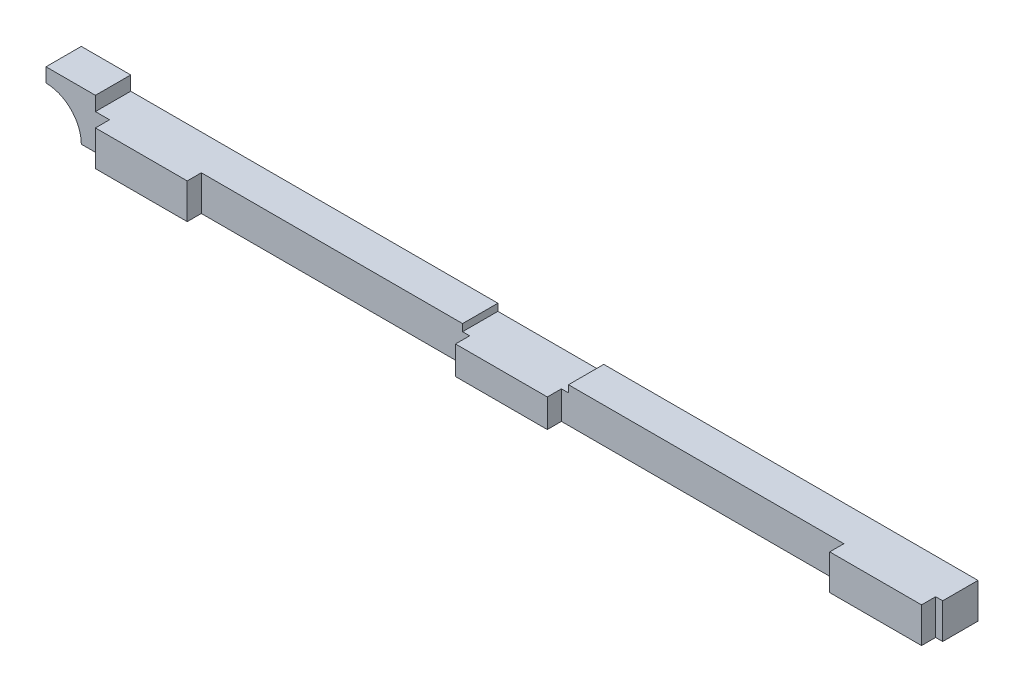
ISO-10303-21;
HEADER;
FILE_DESCRIPTION(('STEP AP214'),'2;1');
FILE_NAME('part.step','',(''),(''),'','','');
FILE_SCHEMA(('AUTOMOTIVE_DESIGN { 1 0 10303 214 1 1 1 1 }'));
ENDSEC;
DATA;
#1=APPLICATION_CONTEXT('core data for automotive mechanical design processes');
#2=APPLICATION_PROTOCOL_DEFINITION('international standard','automotive_design',2000,#1);
#3=PRODUCT_CONTEXT('',#1,'mechanical');
#4=PRODUCT('Part','Part','',(#3));
#5=PRODUCT_RELATED_PRODUCT_CATEGORY('part','',(#4));
#6=PRODUCT_DEFINITION_FORMATION('','',#4);
#7=PRODUCT_DEFINITION_CONTEXT('part definition',#1,'design');
#8=PRODUCT_DEFINITION('design','',#6,#7);
#9=PRODUCT_DEFINITION_SHAPE('','',#8);
#10=(LENGTH_UNIT() NAMED_UNIT(*) SI_UNIT(.MILLI.,.METRE.));
#11=(NAMED_UNIT(*) PLANE_ANGLE_UNIT() SI_UNIT($,.RADIAN.));
#12=(NAMED_UNIT(*) SI_UNIT($,.STERADIAN.) SOLID_ANGLE_UNIT());
#13=UNCERTAINTY_MEASURE_WITH_UNIT(LENGTH_MEASURE(1.E-05),#10,'distance_accuracy_value','');
#14=(GEOMETRIC_REPRESENTATION_CONTEXT(3) GLOBAL_UNCERTAINTY_ASSIGNED_CONTEXT((#13)) GLOBAL_UNIT_ASSIGNED_CONTEXT((#10,
#11,#12)) REPRESENTATION_CONTEXT('',''));
#15=CARTESIAN_POINT('',(0.,0.,0.));
#16=DIRECTION('',(0.,0.,1.));
#17=DIRECTION('',(1.,0.,0.));
#18=AXIS2_PLACEMENT_3D('',#15,#16,#17);
#19=CARTESIAN_POINT('',(-59.,-4.00000000000002,5.));
#20=DIRECTION('',(0.,0.,1.));
#21=DIRECTION('',(1.,0.,0.));
#22=AXIS2_PLACEMENT_3D('',#19,#20,#21);
#23=PLANE('',#22);
#24=DIRECTION('',(-1.,0.,0.));
#25=VECTOR('',#24,1.);
#26=CARTESIAN_POINT('',(68.,-4.,5.));
#27=LINE('',#26,#25);
#28=CARTESIAN_POINT('',(54.,-4.,5.));
#29=VERTEX_POINT('',#28);
#30=CARTESIAN_POINT('',(14.,-4.,5.));
#31=VERTEX_POINT('',#30);
#32=EDGE_CURVE('E307',#29,#31,#27,.T.);
#33=ORIENTED_EDGE('',*,*,#32,.F.);
#34=DIRECTION('',(0.,-1.,0.));
#35=VECTOR('',#34,1.);
#36=CARTESIAN_POINT('',(54.,1.,5.));
#37=LINE('',#36,#35);
#38=CARTESIAN_POINT('',(54.,1.,5.));
#39=VERTEX_POINT('',#38);
#40=EDGE_CURVE('E57',#39,#29,#37,.T.);
#41=ORIENTED_EDGE('',*,*,#40,.F.);
#42=DIRECTION('',(1.,0.,0.));
#43=VECTOR('',#42,1.);
#44=CARTESIAN_POINT('',(15.,1.,5.));
#45=LINE('',#44,#43);
#46=CARTESIAN_POINT('',(15.,1.,5.));
#47=VERTEX_POINT('',#46);
#48=EDGE_CURVE('E337',#47,#39,#45,.T.);
#49=ORIENTED_EDGE('',*,*,#48,.F.);
#50=DIRECTION('',(0.,1.,0.));
#51=VECTOR('',#50,1.);
#52=CARTESIAN_POINT('',(15.,0.,5.));
#53=LINE('',#52,#51);
#54=CARTESIAN_POINT('',(15.,0.,5.));
#55=VERTEX_POINT('',#54);
#56=EDGE_CURVE('E332',#55,#47,#53,.T.);
#57=ORIENTED_EDGE('',*,*,#56,.F.);
#58=DIRECTION('',(1.,0.,0.));
#59=VECTOR('',#58,1.);
#60=CARTESIAN_POINT('',(0.,0.,5.));
#61=LINE('',#60,#59);
#62=CARTESIAN_POINT('',(14.,0.,5.));
#63=VERTEX_POINT('',#62);
#64=EDGE_CURVE('E327',#63,#55,#61,.T.);
#65=ORIENTED_EDGE('',*,*,#64,.F.);
#66=DIRECTION('',(0.,1.,0.));
#67=VECTOR('',#66,1.);
#68=CARTESIAN_POINT('',(14.,0.,5.));
#69=LINE('',#68,#67);
#70=EDGE_CURVE('E226',#31,#63,#69,.T.);
#71=ORIENTED_EDGE('',*,*,#70,.F.);
#72=EDGE_LOOP('',(#33,#41,#49,#57,#65,#71));
#73=FACE_BOUND('',#72,.T.);
#74=ADVANCED_FACE('F39',(#73),#23,.T.);
#75=CARTESIAN_POINT('',(67.,1.,5.));
#76=VERTEX_POINT('',#75);
#77=CARTESIAN_POINT('',(68.,1.,5.));
#78=VERTEX_POINT('',#77);
#79=EDGE_CURVE('E336',#76,#78,#45,.T.);
#80=ORIENTED_EDGE('',*,*,#79,.F.);
#81=DIRECTION('',(0.,1.,0.));
#82=VECTOR('',#81,1.);
#83=CARTESIAN_POINT('',(67.,1.,5.));
#84=LINE('',#83,#82);
#85=CARTESIAN_POINT('',(67.,-4.,5.));
#86=VERTEX_POINT('',#85);
#87=EDGE_CURVE('E217',#86,#76,#84,.T.);
#88=ORIENTED_EDGE('',*,*,#87,.F.);
#89=CARTESIAN_POINT('',(68.,-4.,5.));
#90=VERTEX_POINT('',#89);
#91=EDGE_CURVE('E303',#90,#86,#27,.T.);
#92=ORIENTED_EDGE('',*,*,#91,.F.);
#93=DIRECTION('',(0.,-1.,0.));
#94=VECTOR('',#93,1.);
#95=CARTESIAN_POINT('',(68.,1.,5.));
#96=LINE('',#95,#94);
#97=EDGE_CURVE('E297',#78,#90,#96,.T.);
#98=ORIENTED_EDGE('',*,*,#97,.F.);
#99=EDGE_LOOP('',(#80,#88,#92,#98));
#100=FACE_BOUND('',#99,.T.);
#101=ADVANCED_FACE('F424',(#100),#23,.T.);
#102=CARTESIAN_POINT('',(1.,-4.,5.));
#103=VERTEX_POINT('',#102);
#104=CARTESIAN_POINT('',(-37.,-4.00000000000001,5.));
#105=VERTEX_POINT('',#104);
#106=EDGE_CURVE('E469',#103,#105,#27,.T.);
#107=ORIENTED_EDGE('',*,*,#106,.F.);
#108=DIRECTION('',(0.,-1.,0.));
#109=VECTOR('',#108,1.);
#110=CARTESIAN_POINT('',(1.,0.,5.));
#111=LINE('',#110,#109);
#112=CARTESIAN_POINT('',(1.,0.,5.));
#113=VERTEX_POINT('',#112);
#114=EDGE_CURVE('E221',#113,#103,#111,.T.);
#115=ORIENTED_EDGE('',*,*,#114,.F.);
#116=CARTESIAN_POINT('',(0.,0.,5.));
#117=VERTEX_POINT('',#116);
#118=EDGE_CURVE('E328',#117,#113,#61,.T.);
#119=ORIENTED_EDGE('',*,*,#118,.F.);
#120=DIRECTION('',(0.,1.,0.));
#121=VECTOR('',#120,1.);
#122=CARTESIAN_POINT('',(0.,0.,5.));
#123=LINE('',#122,#121);
#124=CARTESIAN_POINT('',(0.,1.,5.));
#125=VERTEX_POINT('',#124);
#126=EDGE_CURVE('E324',#117,#125,#123,.T.);
#127=ORIENTED_EDGE('',*,*,#126,.T.);
#128=DIRECTION('',(-1.,0.,0.));
#129=VECTOR('',#128,1.);
#130=CARTESIAN_POINT('',(0.,1.,5.));
#131=LINE('',#130,#129);
#132=CARTESIAN_POINT('',(-37.,1.,5.));
#133=VERTEX_POINT('',#132);
#134=EDGE_CURVE('E321',#125,#133,#131,.T.);
#135=ORIENTED_EDGE('',*,*,#134,.T.);
#136=DIRECTION('',(0.,1.,0.));
#137=VECTOR('',#136,1.);
#138=CARTESIAN_POINT('',(-37.,1.,5.));
#139=LINE('',#138,#137);
#140=EDGE_CURVE('E265',#105,#133,#139,.T.);
#141=ORIENTED_EDGE('',*,*,#140,.F.);
#142=EDGE_LOOP('',(#107,#115,#119,#127,#135,#141));
#143=FACE_BOUND('',#142,.T.);
#144=ADVANCED_FACE('F453',(#143),#23,.T.);
#145=DIRECTION('',(0.,-1.,0.));
#146=VECTOR('',#145,1.);
#147=CARTESIAN_POINT('',(-50.,1.,5.));
#148=LINE('',#147,#146);
#149=CARTESIAN_POINT('',(-50.,0.999999999999994,5.));
#150=VERTEX_POINT('',#149);
#151=CARTESIAN_POINT('',(-50.,-4.00000000000001,5.));
#152=VERTEX_POINT('',#151);
#153=EDGE_CURVE('E259',#150,#152,#148,.T.);
#154=ORIENTED_EDGE('',*,*,#153,.F.);
#155=CARTESIAN_POINT('',(-52.,0.999999999999994,5.));
#156=VERTEX_POINT('',#155);
#157=EDGE_CURVE('E320',#150,#156,#131,.T.);
#158=ORIENTED_EDGE('',*,*,#157,.T.);
#159=DIRECTION('',(0.,1.,0.));
#160=VECTOR('',#159,1.);
#161=CARTESIAN_POINT('',(-52.,0.999999999999994,5.));
#162=LINE('',#161,#160);
#163=CARTESIAN_POINT('',(-52.,2.99999999999999,5.));
#164=VERTEX_POINT('',#163);
#165=EDGE_CURVE('E317',#156,#164,#162,.T.);
#166=ORIENTED_EDGE('',*,*,#165,.T.);
#167=DIRECTION('',(-1.,0.,0.));
#168=VECTOR('',#167,1.);
#169=CARTESIAN_POINT('',(-52.,2.99999999999999,5.));
#170=LINE('',#169,#168);
#171=CARTESIAN_POINT('',(-59.,2.99999999999999,5.));
#172=VERTEX_POINT('',#171);
#173=EDGE_CURVE('E314',#164,#172,#170,.T.);
#174=ORIENTED_EDGE('',*,*,#173,.T.);
#175=DIRECTION('',(0.,-1.,0.));
#176=VECTOR('',#175,1.);
#177=CARTESIAN_POINT('',(-59.,2.99999999999999,5.));
#178=LINE('',#177,#176);
#179=CARTESIAN_POINT('',(-59.,0.999999999999987,5.));
#180=VERTEX_POINT('',#179);
#181=EDGE_CURVE('E311',#172,#180,#178,.T.);
#182=ORIENTED_EDGE('',*,*,#181,.T.);
#183=CARTESIAN_POINT('',(-59.,-4.00000000000002,5.));
#184=DIRECTION('',(0.,0.,1.));
#185=DIRECTION('',(1.,0.,0.));
#186=AXIS2_PLACEMENT_3D('',#183,#184,#185);
#187=CIRCLE('',#186,5.);
#188=CARTESIAN_POINT('',(-54.,-4.00000000000002,5.));
#189=VERTEX_POINT('',#188);
#190=EDGE_CURVE('E306',#189,#180,#187,.T.);
#191=ORIENTED_EDGE('',*,*,#190,.F.);
#192=EDGE_CURVE('E301',#152,#189,#27,.T.);
#193=ORIENTED_EDGE('',*,*,#192,.F.);
#194=EDGE_LOOP('',(#154,#158,#166,#174,#182,#191,#193));
#195=FACE_BOUND('',#194,.T.);
#196=ADVANCED_FACE('F457',(#195),#23,.T.);
#197=CARTESIAN_POINT('',(68.,1.,5.));
#198=DIRECTION('',(1.,0.,0.));
#199=DIRECTION('',(0.,0.,-1.));
#200=AXIS2_PLACEMENT_3D('',#197,#198,#199);
#201=PLANE('',#200);
#202=DIRECTION('',(0.,-1.,0.));
#203=VECTOR('',#202,1.);
#204=CARTESIAN_POINT('',(68.,1.,0.));
#205=LINE('',#204,#203);
#206=CARTESIAN_POINT('',(68.,1.,0.));
#207=VERTEX_POINT('',#206);
#208=CARTESIAN_POINT('',(68.,-4.,0.));
#209=VERTEX_POINT('',#208);
#210=EDGE_CURVE('E296',#207,#209,#205,.T.);
#211=ORIENTED_EDGE('',*,*,#210,.F.);
#212=DIRECTION('',(0.,0.,-1.));
#213=VECTOR('',#212,1.);
#214=CARTESIAN_POINT('',(68.,1.,5.));
#215=LINE('',#214,#213);
#216=EDGE_CURVE('E11',#78,#207,#215,.T.);
#217=ORIENTED_EDGE('',*,*,#216,.F.);
#218=ORIENTED_EDGE('',*,*,#97,.T.);
#219=DIRECTION('',(0.,0.,-1.));
#220=VECTOR('',#219,1.);
#221=CARTESIAN_POINT('',(68.,-4.,5.));
#222=LINE('',#221,#220);
#223=EDGE_CURVE('E43',#90,#209,#222,.T.);
#224=ORIENTED_EDGE('',*,*,#223,.T.);
#225=EDGE_LOOP('',(#211,#217,#218,#224));
#226=FACE_BOUND('',#225,.T.);
#227=ADVANCED_FACE('F41',(#226),#201,.T.);
#228=CARTESIAN_POINT('',(15.,1.,5.));
#229=DIRECTION('',(0.,1.,0.));
#230=DIRECTION('',(0.,0.,1.));
#231=AXIS2_PLACEMENT_3D('',#228,#229,#230);
#232=PLANE('',#231);
#233=DIRECTION('',(1.,0.,0.));
#234=VECTOR('',#233,1.);
#235=CARTESIAN_POINT('',(15.,1.,0.));
#236=LINE('',#235,#234);
#237=CARTESIAN_POINT('',(15.,1.,0.));
#238=VERTEX_POINT('',#237);
#239=EDGE_CURVE('E302',#238,#207,#236,.T.);
#240=ORIENTED_EDGE('',*,*,#239,.F.);
#241=DIRECTION('',(0.,0.,-1.));
#242=VECTOR('',#241,1.);
#243=CARTESIAN_POINT('',(15.,1.,5.));
#244=LINE('',#243,#242);
#245=EDGE_CURVE('E49',#47,#238,#244,.T.);
#246=ORIENTED_EDGE('',*,*,#245,.F.);
#247=ORIENTED_EDGE('',*,*,#48,.T.);
#248=DIRECTION('',(0.,0.,-1.));
#249=VECTOR('',#248,1.);
#250=CARTESIAN_POINT('',(54.,1.,7.));
#251=LINE('',#250,#249);
#252=CARTESIAN_POINT('',(54.,1.,7.));
#253=VERTEX_POINT('',#252);
#254=EDGE_CURVE('E434',#253,#39,#251,.T.);
#255=ORIENTED_EDGE('',*,*,#254,.F.);
#256=DIRECTION('',(-1.,0.,0.));
#257=VECTOR('',#256,1.);
#258=CARTESIAN_POINT('',(54.,1.,7.));
#259=LINE('',#258,#257);
#260=CARTESIAN_POINT('',(67.,1.,7.));
#261=VERTEX_POINT('',#260);
#262=EDGE_CURVE('E214',#261,#253,#259,.T.);
#263=ORIENTED_EDGE('',*,*,#262,.F.);
#264=DIRECTION('',(0.,0.,-1.));
#265=VECTOR('',#264,1.);
#266=CARTESIAN_POINT('',(67.,1.,7.));
#267=LINE('',#266,#265);
#268=EDGE_CURVE('E228',#261,#76,#267,.T.);
#269=ORIENTED_EDGE('',*,*,#268,.T.);
#270=ORIENTED_EDGE('',*,*,#79,.T.);
#271=ORIENTED_EDGE('',*,*,#216,.T.);
#272=EDGE_LOOP('',(#240,#246,#247,#255,#263,#269,#270,#271));
#273=FACE_BOUND('',#272,.T.);
#274=ADVANCED_FACE('F420',(#273),#232,.T.);
#275=CARTESIAN_POINT('',(15.,0.,5.));
#276=DIRECTION('',(-1.,0.,0.));
#277=DIRECTION('',(0.,0.,1.));
#278=AXIS2_PLACEMENT_3D('',#275,#276,#277);
#279=PLANE('',#278);
#280=DIRECTION('',(0.,1.,0.));
#281=VECTOR('',#280,1.);
#282=CARTESIAN_POINT('',(15.,0.,0.));
#283=LINE('',#282,#281);
#284=CARTESIAN_POINT('',(15.,0.,0.));
#285=VERTEX_POINT('',#284);
#286=EDGE_CURVE('E372',#285,#238,#283,.T.);
#287=ORIENTED_EDGE('',*,*,#286,.F.);
#288=DIRECTION('',(0.,0.,-1.));
#289=VECTOR('',#288,1.);
#290=CARTESIAN_POINT('',(15.,0.,5.));
#291=LINE('',#290,#289);
#292=EDGE_CURVE('E381',#55,#285,#291,.T.);
#293=ORIENTED_EDGE('',*,*,#292,.F.);
#294=ORIENTED_EDGE('',*,*,#56,.T.);
#295=ORIENTED_EDGE('',*,*,#245,.T.);
#296=EDGE_LOOP('',(#287,#293,#294,#295));
#297=FACE_BOUND('',#296,.T.);
#298=ADVANCED_FACE('F511',(#297),#279,.T.);
#299=CARTESIAN_POINT('',(0.,0.,5.));
#300=DIRECTION('',(0.,1.,0.));
#301=DIRECTION('',(0.,0.,1.));
#302=AXIS2_PLACEMENT_3D('',#299,#300,#301);
#303=PLANE('',#302);
#304=DIRECTION('',(1.,0.,0.));
#305=VECTOR('',#304,1.);
#306=CARTESIAN_POINT('',(0.,0.,0.));
#307=LINE('',#306,#305);
#308=CARTESIAN_POINT('',(0.,0.,0.));
#309=VERTEX_POINT('',#308);
#310=EDGE_CURVE('E368',#309,#285,#307,.T.);
#311=ORIENTED_EDGE('',*,*,#310,.F.);
#312=DIRECTION('',(0.,0.,-1.));
#313=VECTOR('',#312,1.);
#314=CARTESIAN_POINT('',(0.,0.,5.));
#315=LINE('',#314,#313);
#316=EDGE_CURVE('E384',#117,#309,#315,.T.);
#317=ORIENTED_EDGE('',*,*,#316,.F.);
#318=ORIENTED_EDGE('',*,*,#118,.T.);
#319=DIRECTION('',(0.,0.,-1.));
#320=VECTOR('',#319,1.);
#321=CARTESIAN_POINT('',(1.,0.,7.));
#322=LINE('',#321,#320);
#323=CARTESIAN_POINT('',(1.,0.,7.));
#324=VERTEX_POINT('',#323);
#325=EDGE_CURVE('E244',#324,#113,#322,.T.);
#326=ORIENTED_EDGE('',*,*,#325,.F.);
#327=DIRECTION('',(-1.,0.,0.));
#328=VECTOR('',#327,1.);
#329=CARTESIAN_POINT('',(1.,0.,7.));
#330=LINE('',#329,#328);
#331=CARTESIAN_POINT('',(14.,0.,7.));
#332=VERTEX_POINT('',#331);
#333=EDGE_CURVE('E242',#332,#324,#330,.T.);
#334=ORIENTED_EDGE('',*,*,#333,.F.);
#335=DIRECTION('',(0.,0.,-1.));
#336=VECTOR('',#335,1.);
#337=CARTESIAN_POINT('',(14.,0.,7.));
#338=LINE('',#337,#336);
#339=EDGE_CURVE('E65',#332,#63,#338,.T.);
#340=ORIENTED_EDGE('',*,*,#339,.T.);
#341=ORIENTED_EDGE('',*,*,#64,.T.);
#342=ORIENTED_EDGE('',*,*,#292,.T.);
#343=EDGE_LOOP('',(#311,#317,#318,#326,#334,#340,#341,#342));
#344=FACE_BOUND('',#343,.T.);
#345=ADVANCED_FACE('F505',(#344),#303,.T.);
#346=CARTESIAN_POINT('',(0.,0.,5.));
#347=DIRECTION('',(-1.,0.,0.));
#348=DIRECTION('',(0.,0.,1.));
#349=AXIS2_PLACEMENT_3D('',#346,#347,#348);
#350=PLANE('',#349);
#351=DIRECTION('',(0.,1.,0.));
#352=VECTOR('',#351,1.);
#353=CARTESIAN_POINT('',(0.,0.,0.));
#354=LINE('',#353,#352);
#355=CARTESIAN_POINT('',(0.,1.,0.));
#356=VERTEX_POINT('',#355);
#357=EDGE_CURVE('E365',#309,#356,#354,.T.);
#358=ORIENTED_EDGE('',*,*,#357,.T.);
#359=DIRECTION('',(0.,0.,-1.));
#360=VECTOR('',#359,1.);
#361=CARTESIAN_POINT('',(0.,1.,5.));
#362=LINE('',#361,#360);
#363=EDGE_CURVE('E387',#125,#356,#362,.T.);
#364=ORIENTED_EDGE('',*,*,#363,.F.);
#365=ORIENTED_EDGE('',*,*,#126,.F.);
#366=ORIENTED_EDGE('',*,*,#316,.T.);
#367=EDGE_LOOP('',(#358,#364,#365,#366));
#368=FACE_BOUND('',#367,.T.);
#369=ADVANCED_FACE('F524',(#368),#350,.F.);
#370=CARTESIAN_POINT('',(0.,1.,5.));
#371=DIRECTION('',(0.,-1.,0.));
#372=DIRECTION('',(1.,0.,0.));
#373=AXIS2_PLACEMENT_3D('',#370,#371,#372);
#374=PLANE('',#373);
#375=DIRECTION('',(-1.,0.,0.));
#376=VECTOR('',#375,1.);
#377=CARTESIAN_POINT('',(0.,1.,0.));
#378=LINE('',#377,#376);
#379=CARTESIAN_POINT('',(-52.,0.999999999999994,0.));
#380=VERTEX_POINT('',#379);
#381=EDGE_CURVE('E362',#356,#380,#378,.T.);
#382=ORIENTED_EDGE('',*,*,#381,.T.);
#383=DIRECTION('',(0.,0.,-1.));
#384=VECTOR('',#383,1.);
#385=CARTESIAN_POINT('',(-52.,0.999999999999994,5.));
#386=LINE('',#385,#384);
#387=EDGE_CURVE('E391',#156,#380,#386,.T.);
#388=ORIENTED_EDGE('',*,*,#387,.F.);
#389=ORIENTED_EDGE('',*,*,#157,.F.);
#390=DIRECTION('',(0.,0.,-1.));
#391=VECTOR('',#390,1.);
#392=CARTESIAN_POINT('',(-50.,1.,7.));
#393=LINE('',#392,#391);
#394=CARTESIAN_POINT('',(-50.,1.,7.));
#395=VERTEX_POINT('',#394);
#396=EDGE_CURVE('E274',#395,#150,#393,.T.);
#397=ORIENTED_EDGE('',*,*,#396,.F.);
#398=DIRECTION('',(-1.,0.,0.));
#399=VECTOR('',#398,1.);
#400=CARTESIAN_POINT('',(-50.,1.,7.));
#401=LINE('',#400,#399);
#402=CARTESIAN_POINT('',(-37.,1.,7.));
#403=VERTEX_POINT('',#402);
#404=EDGE_CURVE('E271',#403,#395,#401,.T.);
#405=ORIENTED_EDGE('',*,*,#404,.F.);
#406=DIRECTION('',(0.,0.,-1.));
#407=VECTOR('',#406,1.);
#408=CARTESIAN_POINT('',(-37.,1.,7.));
#409=LINE('',#408,#407);
#410=EDGE_CURVE('E284',#403,#133,#409,.T.);
#411=ORIENTED_EDGE('',*,*,#410,.T.);
#412=ORIENTED_EDGE('',*,*,#134,.F.);
#413=ORIENTED_EDGE('',*,*,#363,.T.);
#414=EDGE_LOOP('',(#382,#388,#389,#397,#405,#411,#412,#413));
#415=FACE_BOUND('',#414,.T.);
#416=ADVANCED_FACE('F498',(#415),#374,.F.);
#417=CARTESIAN_POINT('',(-52.,0.999999999999994,5.));
#418=DIRECTION('',(-1.,0.,0.));
#419=DIRECTION('',(0.,0.,1.));
#420=AXIS2_PLACEMENT_3D('',#417,#418,#419);
#421=PLANE('',#420);
#422=DIRECTION('',(0.,1.,0.));
#423=VECTOR('',#422,1.);
#424=CARTESIAN_POINT('',(-52.,0.999999999999994,0.));
#425=LINE('',#424,#423);
#426=CARTESIAN_POINT('',(-52.,2.99999999999999,0.));
#427=VERTEX_POINT('',#426);
#428=EDGE_CURVE('E359',#380,#427,#425,.T.);
#429=ORIENTED_EDGE('',*,*,#428,.T.);
#430=DIRECTION('',(0.,0.,-1.));
#431=VECTOR('',#430,1.);
#432=CARTESIAN_POINT('',(-52.,2.99999999999999,5.));
#433=LINE('',#432,#431);
#434=EDGE_CURVE('E395',#164,#427,#433,.T.);
#435=ORIENTED_EDGE('',*,*,#434,.F.);
#436=ORIENTED_EDGE('',*,*,#165,.F.);
#437=ORIENTED_EDGE('',*,*,#387,.T.);
#438=EDGE_LOOP('',(#429,#435,#436,#437));
#439=FACE_BOUND('',#438,.T.);
#440=ADVANCED_FACE('F494',(#439),#421,.F.);
#441=CARTESIAN_POINT('',(-52.,2.99999999999999,5.));
#442=DIRECTION('',(0.,-1.,0.));
#443=DIRECTION('',(1.,0.,0.));
#444=AXIS2_PLACEMENT_3D('',#441,#442,#443);
#445=PLANE('',#444);
#446=DIRECTION('',(-1.,0.,0.));
#447=VECTOR('',#446,1.);
#448=CARTESIAN_POINT('',(-52.,2.99999999999999,0.));
#449=LINE('',#448,#447);
#450=CARTESIAN_POINT('',(-59.,2.99999999999999,0.));
#451=VERTEX_POINT('',#450);
#452=EDGE_CURVE('E356',#427,#451,#449,.T.);
#453=ORIENTED_EDGE('',*,*,#452,.T.);
#454=DIRECTION('',(0.,0.,-1.));
#455=VECTOR('',#454,1.);
#456=CARTESIAN_POINT('',(-59.,2.99999999999999,5.));
#457=LINE('',#456,#455);
#458=EDGE_CURVE('E399',#172,#451,#457,.T.);
#459=ORIENTED_EDGE('',*,*,#458,.F.);
#460=ORIENTED_EDGE('',*,*,#173,.F.);
#461=ORIENTED_EDGE('',*,*,#434,.T.);
#462=EDGE_LOOP('',(#453,#459,#460,#461));
#463=FACE_BOUND('',#462,.T.);
#464=ADVANCED_FACE('F490',(#463),#445,.F.);
#465=CARTESIAN_POINT('',(-59.,2.99999999999999,5.));
#466=DIRECTION('',(1.,0.,0.));
#467=DIRECTION('',(0.,0.,-1.));
#468=AXIS2_PLACEMENT_3D('',#465,#466,#467);
#469=PLANE('',#468);
#470=DIRECTION('',(0.,-1.,0.));
#471=VECTOR('',#470,1.);
#472=CARTESIAN_POINT('',(-59.,2.99999999999999,0.));
#473=LINE('',#472,#471);
#474=CARTESIAN_POINT('',(-59.,0.999999999999987,0.));
#475=VERTEX_POINT('',#474);
#476=EDGE_CURVE('E352',#451,#475,#473,.T.);
#477=ORIENTED_EDGE('',*,*,#476,.T.);
#478=DIRECTION('',(0.,0.,-1.));
#479=VECTOR('',#478,1.);
#480=CARTESIAN_POINT('',(-59.,0.999999999999987,5.));
#481=LINE('',#480,#479);
#482=EDGE_CURVE('E403',#180,#475,#481,.T.);
#483=ORIENTED_EDGE('',*,*,#482,.F.);
#484=ORIENTED_EDGE('',*,*,#181,.F.);
#485=ORIENTED_EDGE('',*,*,#458,.T.);
#486=EDGE_LOOP('',(#477,#483,#484,#485));
#487=FACE_BOUND('',#486,.T.);
#488=ADVANCED_FACE('F484',(#487),#469,.F.);
#489=CARTESIAN_POINT('',(-59.,-4.00000000000002,5.));
#490=DIRECTION('',(0.,0.,-1.));
#491=DIRECTION('',(-1.,0.,0.));
#492=AXIS2_PLACEMENT_3D('',#489,#490,#491);
#493=CYLINDRICAL_SURFACE('',#492,5.);
#494=CARTESIAN_POINT('',(-59.,-4.00000000000002,0.));
#495=DIRECTION('',(0.,0.,1.));
#496=DIRECTION('',(1.,0.,0.));
#497=AXIS2_PLACEMENT_3D('',#494,#495,#496);
#498=CIRCLE('',#497,5.);
#499=CARTESIAN_POINT('',(-54.,-4.00000000000002,0.));
#500=VERTEX_POINT('',#499);
#501=EDGE_CURVE('E348',#500,#475,#498,.T.);
#502=ORIENTED_EDGE('',*,*,#501,.F.);
#503=DIRECTION('',(0.,0.,-1.));
#504=VECTOR('',#503,1.);
#505=CARTESIAN_POINT('',(-54.,-4.00000000000002,5.));
#506=LINE('',#505,#504);
#507=EDGE_CURVE('E405',#189,#500,#506,.T.);
#508=ORIENTED_EDGE('',*,*,#507,.F.);
#509=ORIENTED_EDGE('',*,*,#190,.T.);
#510=ORIENTED_EDGE('',*,*,#482,.T.);
#511=EDGE_LOOP('',(#502,#508,#509,#510));
#512=FACE_BOUND('',#511,.T.);
#513=ADVANCED_FACE('F478',(#512),#493,.F.);
#514=CARTESIAN_POINT('',(68.,-4.,5.));
#515=DIRECTION('',(0.,-1.,0.));
#516=DIRECTION('',(1.,0.,0.));
#517=AXIS2_PLACEMENT_3D('',#514,#515,#516);
#518=PLANE('',#517);
#519=DIRECTION('',(-1.,0.,0.));
#520=VECTOR('',#519,1.);
#521=CARTESIAN_POINT('',(68.,-4.,0.));
#522=LINE('',#521,#520);
#523=EDGE_CURVE('E344',#209,#500,#522,.T.);
#524=ORIENTED_EDGE('',*,*,#523,.F.);
#525=ORIENTED_EDGE('',*,*,#223,.F.);
#526=ORIENTED_EDGE('',*,*,#91,.T.);
#527=DIRECTION('',(0.,0.,-1.));
#528=VECTOR('',#527,1.);
#529=CARTESIAN_POINT('',(67.,-4.,7.));
#530=LINE('',#529,#528);
#531=CARTESIAN_POINT('',(67.,-4.,7.));
#532=VERTEX_POINT('',#531);
#533=EDGE_CURVE('E204',#532,#86,#530,.T.);
#534=ORIENTED_EDGE('',*,*,#533,.F.);
#535=DIRECTION('',(1.,0.,0.));
#536=VECTOR('',#535,1.);
#537=CARTESIAN_POINT('',(54.,-4.,7.));
#538=LINE('',#537,#536);
#539=CARTESIAN_POINT('',(54.,-4.,7.));
#540=VERTEX_POINT('',#539);
#541=EDGE_CURVE('E197',#540,#532,#538,.T.);
#542=ORIENTED_EDGE('',*,*,#541,.F.);
#543=DIRECTION('',(0.,0.,-1.));
#544=VECTOR('',#543,1.);
#545=CARTESIAN_POINT('',(54.,-4.,7.));
#546=LINE('',#545,#544);
#547=EDGE_CURVE('E201',#540,#29,#546,.T.);
#548=ORIENTED_EDGE('',*,*,#547,.T.);
#549=ORIENTED_EDGE('',*,*,#32,.T.);
#550=DIRECTION('',(0.,0.,-1.));
#551=VECTOR('',#550,1.);
#552=CARTESIAN_POINT('',(14.,-4.,7.));
#553=LINE('',#552,#551);
#554=CARTESIAN_POINT('',(14.,-4.,7.));
#555=VERTEX_POINT('',#554);
#556=EDGE_CURVE('E252',#555,#31,#553,.T.);
#557=ORIENTED_EDGE('',*,*,#556,.F.);
#558=DIRECTION('',(1.,0.,0.));
#559=VECTOR('',#558,1.);
#560=CARTESIAN_POINT('',(1.,-4.,7.));
#561=LINE('',#560,#559);
#562=CARTESIAN_POINT('',(1.,-4.,7.));
#563=VERTEX_POINT('',#562);
#564=EDGE_CURVE('E236',#563,#555,#561,.T.);
#565=ORIENTED_EDGE('',*,*,#564,.F.);
#566=DIRECTION('',(0.,0.,-1.));
#567=VECTOR('',#566,1.);
#568=CARTESIAN_POINT('',(1.,-4.,7.));
#569=LINE('',#568,#567);
#570=EDGE_CURVE('E256',#563,#103,#569,.T.);
#571=ORIENTED_EDGE('',*,*,#570,.T.);
#572=ORIENTED_EDGE('',*,*,#106,.T.);
#573=DIRECTION('',(0.,0.,-1.));
#574=VECTOR('',#573,1.);
#575=CARTESIAN_POINT('',(-37.,-4.,7.));
#576=LINE('',#575,#574);
#577=CARTESIAN_POINT('',(-37.,-4.,7.));
#578=VERTEX_POINT('',#577);
#579=EDGE_CURVE('E288',#578,#105,#576,.T.);
#580=ORIENTED_EDGE('',*,*,#579,.F.);
#581=DIRECTION('',(1.,0.,0.));
#582=VECTOR('',#581,1.);
#583=CARTESIAN_POINT('',(-50.,-4.,7.));
#584=LINE('',#583,#582);
#585=CARTESIAN_POINT('',(-50.,-4.,7.));
#586=VERTEX_POINT('',#585);
#587=EDGE_CURVE('E264',#586,#578,#584,.T.);
#588=ORIENTED_EDGE('',*,*,#587,.F.);
#589=DIRECTION('',(0.,0.,-1.));
#590=VECTOR('',#589,1.);
#591=CARTESIAN_POINT('',(-50.,-4.,7.));
#592=LINE('',#591,#590);
#593=EDGE_CURVE('E292',#586,#152,#592,.T.);
#594=ORIENTED_EDGE('',*,*,#593,.T.);
#595=ORIENTED_EDGE('',*,*,#192,.T.);
#596=ORIENTED_EDGE('',*,*,#507,.T.);
#597=EDGE_LOOP('',(#524,#525,#526,#534,#542,#548,#549,#557,#565,#571,#572,#580,#588,#594,#595,#596));
#598=FACE_BOUND('',#597,.T.);
#599=ADVANCED_FACE('F200',(#598),#518,.T.);
#600=CARTESIAN_POINT('',(-59.,-4.00000000000002,0.));
#601=DIRECTION('',(0.,0.,1.));
#602=DIRECTION('',(1.,0.,0.));
#603=AXIS2_PLACEMENT_3D('',#600,#601,#602);
#604=PLANE('',#603);
#605=ORIENTED_EDGE('',*,*,#210,.T.);
#606=ORIENTED_EDGE('',*,*,#523,.T.);
#607=ORIENTED_EDGE('',*,*,#501,.T.);
#608=ORIENTED_EDGE('',*,*,#476,.F.);
#609=ORIENTED_EDGE('',*,*,#452,.F.);
#610=ORIENTED_EDGE('',*,*,#428,.F.);
#611=ORIENTED_EDGE('',*,*,#381,.F.);
#612=ORIENTED_EDGE('',*,*,#357,.F.);
#613=ORIENTED_EDGE('',*,*,#310,.T.);
#614=ORIENTED_EDGE('',*,*,#286,.T.);
#615=ORIENTED_EDGE('',*,*,#239,.T.);
#616=EDGE_LOOP('',(#605,#606,#607,#608,#609,#610,#611,#612,#613,#614,#615));
#617=FACE_BOUND('',#616,.T.);
#618=ADVANCED_FACE('F416',(#617),#604,.F.);
#619=CARTESIAN_POINT('',(-50.,1.,7.));
#620=DIRECTION('',(1.,0.,0.));
#621=DIRECTION('',(0.,0.,-1.));
#622=AXIS2_PLACEMENT_3D('',#619,#620,#621);
#623=PLANE('',#622);
#624=ORIENTED_EDGE('',*,*,#153,.T.);
#625=ORIENTED_EDGE('',*,*,#593,.F.);
#626=DIRECTION('',(0.,-1.,0.));
#627=VECTOR('',#626,1.);
#628=CARTESIAN_POINT('',(-50.,1.,7.));
#629=LINE('',#628,#627);
#630=EDGE_CURVE('E260',#395,#586,#629,.T.);
#631=ORIENTED_EDGE('',*,*,#630,.F.);
#632=ORIENTED_EDGE('',*,*,#396,.T.);
#633=EDGE_LOOP('',(#624,#625,#631,#632));
#634=FACE_BOUND('',#633,.T.);
#635=ADVANCED_FACE('F534',(#634),#623,.F.);
#636=CARTESIAN_POINT('',(-37.,1.,7.));
#637=DIRECTION('',(-1.,0.,0.));
#638=DIRECTION('',(0.,0.,1.));
#639=AXIS2_PLACEMENT_3D('',#636,#637,#638);
#640=PLANE('',#639);
#641=ORIENTED_EDGE('',*,*,#140,.T.);
#642=ORIENTED_EDGE('',*,*,#410,.F.);
#643=DIRECTION('',(0.,1.,0.));
#644=VECTOR('',#643,1.);
#645=CARTESIAN_POINT('',(-37.,1.,7.));
#646=LINE('',#645,#644);
#647=EDGE_CURVE('E268',#578,#403,#646,.T.);
#648=ORIENTED_EDGE('',*,*,#647,.F.);
#649=ORIENTED_EDGE('',*,*,#579,.T.);
#650=EDGE_LOOP('',(#641,#642,#648,#649));
#651=FACE_BOUND('',#650,.T.);
#652=ADVANCED_FACE('F529',(#651),#640,.F.);
#653=CARTESIAN_POINT('',(0.,0.,7.));
#654=DIRECTION('',(0.,0.,1.));
#655=DIRECTION('',(1.,0.,0.));
#656=AXIS2_PLACEMENT_3D('',#653,#654,#655);
#657=PLANE('',#656);
#658=ORIENTED_EDGE('',*,*,#630,.T.);
#659=ORIENTED_EDGE('',*,*,#587,.T.);
#660=ORIENTED_EDGE('',*,*,#647,.T.);
#661=ORIENTED_EDGE('',*,*,#404,.T.);
#662=EDGE_LOOP('',(#658,#659,#660,#661));
#663=FACE_BOUND('',#662,.T.);
#664=ADVANCED_FACE('F532',(#663),#657,.T.);
#665=CARTESIAN_POINT('',(1.,0.,7.));
#666=DIRECTION('',(1.,0.,0.));
#667=DIRECTION('',(0.,1.,0.));
#668=AXIS2_PLACEMENT_3D('',#665,#666,#667);
#669=PLANE('',#668);
#670=ORIENTED_EDGE('',*,*,#114,.T.);
#671=ORIENTED_EDGE('',*,*,#570,.F.);
#672=DIRECTION('',(0.,-1.,0.));
#673=VECTOR('',#672,1.);
#674=CARTESIAN_POINT('',(1.,0.,7.));
#675=LINE('',#674,#673);
#676=EDGE_CURVE('E232',#324,#563,#675,.T.);
#677=ORIENTED_EDGE('',*,*,#676,.F.);
#678=ORIENTED_EDGE('',*,*,#325,.T.);
#679=EDGE_LOOP('',(#670,#671,#677,#678));
#680=FACE_BOUND('',#679,.T.);
#681=ADVANCED_FACE('F523',(#680),#669,.F.);
#682=CARTESIAN_POINT('',(14.,0.,7.));
#683=DIRECTION('',(-1.,0.,0.));
#684=DIRECTION('',(0.,0.,1.));
#685=AXIS2_PLACEMENT_3D('',#682,#683,#684);
#686=PLANE('',#685);
#687=ORIENTED_EDGE('',*,*,#70,.T.);
#688=ORIENTED_EDGE('',*,*,#339,.F.);
#689=DIRECTION('',(0.,1.,0.));
#690=VECTOR('',#689,1.);
#691=CARTESIAN_POINT('',(14.,0.,7.));
#692=LINE('',#691,#690);
#693=EDGE_CURVE('E239',#555,#332,#692,.T.);
#694=ORIENTED_EDGE('',*,*,#693,.F.);
#695=ORIENTED_EDGE('',*,*,#556,.T.);
#696=EDGE_LOOP('',(#687,#688,#694,#695));
#697=FACE_BOUND('',#696,.T.);
#698=ADVANCED_FACE('F517',(#697),#686,.F.);
#699=CARTESIAN_POINT('',(0.,0.,7.));
#700=DIRECTION('',(0.,0.,1.));
#701=DIRECTION('',(1.,0.,0.));
#702=AXIS2_PLACEMENT_3D('',#699,#700,#701);
#703=PLANE('',#702);
#704=ORIENTED_EDGE('',*,*,#676,.T.);
#705=ORIENTED_EDGE('',*,*,#564,.T.);
#706=ORIENTED_EDGE('',*,*,#693,.T.);
#707=ORIENTED_EDGE('',*,*,#333,.T.);
#708=EDGE_LOOP('',(#704,#705,#706,#707));
#709=FACE_BOUND('',#708,.T.);
#710=ADVANCED_FACE('F448',(#709),#703,.T.);
#711=CARTESIAN_POINT('',(54.,1.,7.));
#712=DIRECTION('',(1.,0.,0.));
#713=DIRECTION('',(0.,0.,-1.));
#714=AXIS2_PLACEMENT_3D('',#711,#712,#713);
#715=PLANE('',#714);
#716=ORIENTED_EDGE('',*,*,#40,.T.);
#717=ORIENTED_EDGE('',*,*,#547,.F.);
#718=DIRECTION('',(0.,-1.,0.));
#719=VECTOR('',#718,1.);
#720=CARTESIAN_POINT('',(54.,1.,7.));
#721=LINE('',#720,#719);
#722=EDGE_CURVE('E209',#253,#540,#721,.T.);
#723=ORIENTED_EDGE('',*,*,#722,.F.);
#724=ORIENTED_EDGE('',*,*,#254,.T.);
#725=EDGE_LOOP('',(#716,#717,#723,#724));
#726=FACE_BOUND('',#725,.T.);
#727=ADVANCED_FACE('F219',(#726),#715,.F.);
#728=CARTESIAN_POINT('',(67.,1.,7.));
#729=DIRECTION('',(-1.,0.,0.));
#730=DIRECTION('',(0.,0.,1.));
#731=AXIS2_PLACEMENT_3D('',#728,#729,#730);
#732=PLANE('',#731);
#733=ORIENTED_EDGE('',*,*,#87,.T.);
#734=ORIENTED_EDGE('',*,*,#268,.F.);
#735=DIRECTION('',(0.,1.,0.));
#736=VECTOR('',#735,1.);
#737=CARTESIAN_POINT('',(67.,1.,7.));
#738=LINE('',#737,#736);
#739=EDGE_CURVE('E208',#532,#261,#738,.T.);
#740=ORIENTED_EDGE('',*,*,#739,.F.);
#741=ORIENTED_EDGE('',*,*,#533,.T.);
#742=EDGE_LOOP('',(#733,#734,#740,#741));
#743=FACE_BOUND('',#742,.T.);
#744=ADVANCED_FACE('F437',(#743),#732,.F.);
#745=CARTESIAN_POINT('',(0.,0.,7.));
#746=DIRECTION('',(0.,0.,1.));
#747=DIRECTION('',(1.,0.,0.));
#748=AXIS2_PLACEMENT_3D('',#745,#746,#747);
#749=PLANE('',#748);
#750=ORIENTED_EDGE('',*,*,#722,.T.);
#751=ORIENTED_EDGE('',*,*,#541,.T.);
#752=ORIENTED_EDGE('',*,*,#739,.T.);
#753=ORIENTED_EDGE('',*,*,#262,.T.);
#754=EDGE_LOOP('',(#750,#751,#752,#753));
#755=FACE_BOUND('',#754,.T.);
#756=ADVANCED_FACE('F212',(#755),#749,.T.);
#757=CLOSED_SHELL('',(#74,#101,#144,#196,#227,#274,#298,#345,#369,#416,#440,#464,#488,#513,#599,
#618,#635,#652,#664,#681,#698,#710,#727,#744,#756));
#758=MANIFOLD_SOLID_BREP('B2',#757);
#759=ADVANCED_BREP_SHAPE_REPRESENTATION('',(#18,#758),#14);
#760=SHAPE_DEFINITION_REPRESENTATION(#9,#759);
ENDSEC;
END-ISO-10303-21;
